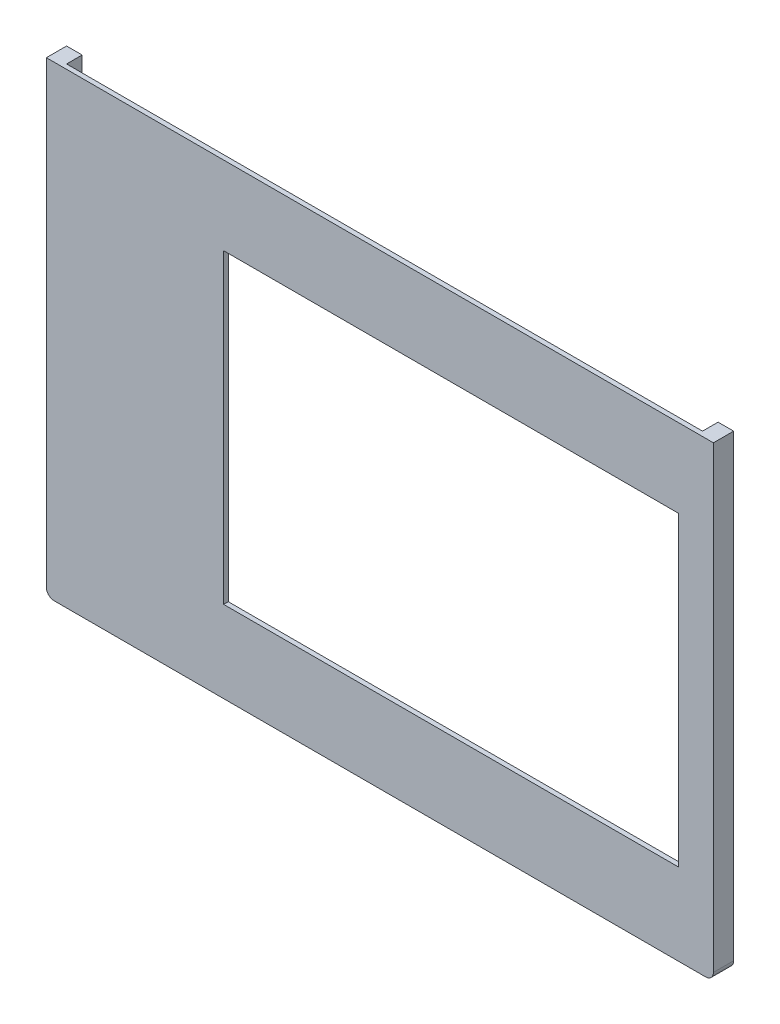
ISO-10303-21;
HEADER;
FILE_DESCRIPTION(('STEP AP214'),'2;1');
FILE_NAME('part.step','',(''),(''),'','','');
FILE_SCHEMA(('AUTOMOTIVE_DESIGN { 1 0 10303 214 1 1 1 1 }'));
ENDSEC;
DATA;
#1=APPLICATION_CONTEXT('core data for automotive mechanical design processes');
#2=APPLICATION_PROTOCOL_DEFINITION('international standard','automotive_design',2000,#1);
#3=PRODUCT_CONTEXT('',#1,'mechanical');
#4=PRODUCT('Part','Part','',(#3));
#5=PRODUCT_RELATED_PRODUCT_CATEGORY('part','',(#4));
#6=PRODUCT_DEFINITION_FORMATION('','',#4);
#7=PRODUCT_DEFINITION_CONTEXT('part definition',#1,'design');
#8=PRODUCT_DEFINITION('design','',#6,#7);
#9=PRODUCT_DEFINITION_SHAPE('','',#8);
#10=(LENGTH_UNIT() NAMED_UNIT(*) SI_UNIT(.MILLI.,.METRE.));
#11=(NAMED_UNIT(*) PLANE_ANGLE_UNIT() SI_UNIT($,.RADIAN.));
#12=(NAMED_UNIT(*) SI_UNIT($,.STERADIAN.) SOLID_ANGLE_UNIT());
#13=UNCERTAINTY_MEASURE_WITH_UNIT(LENGTH_MEASURE(1.E-05),#10,'distance_accuracy_value','');
#14=(GEOMETRIC_REPRESENTATION_CONTEXT(3) GLOBAL_UNCERTAINTY_ASSIGNED_CONTEXT((#13)) GLOBAL_UNIT_ASSIGNED_CONTEXT((#10,
#11,#12)) REPRESENTATION_CONTEXT('',''));
#15=CARTESIAN_POINT('',(0.,0.,0.));
#16=DIRECTION('',(0.,0.,1.));
#17=DIRECTION('',(1.,0.,0.));
#18=AXIS2_PLACEMENT_3D('',#15,#16,#17);
#19=CARTESIAN_POINT('',(0.,0.,0.));
#20=DIRECTION('',(0.,0.,1.));
#21=DIRECTION('',(1.,0.,0.));
#22=AXIS2_PLACEMENT_3D('',#19,#20,#21);
#23=PLANE('',#22);
#24=DIRECTION('',(0.,-1.,0.));
#25=VECTOR('',#24,1.);
#26=CARTESIAN_POINT('',(-20.1,19.9,0.));
#27=LINE('',#26,#25);
#28=CARTESIAN_POINT('',(-20.1,19.9,0.));
#29=VERTEX_POINT('',#28);
#30=CARTESIAN_POINT('',(-20.1,-19.5,0.));
#31=VERTEX_POINT('',#30);
#32=EDGE_CURVE('E218',#29,#31,#27,.T.);
#33=ORIENTED_EDGE('',*,*,#32,.T.);
#34=DIRECTION('',(1.,0.,0.));
#35=VECTOR('',#34,1.);
#36=CARTESIAN_POINT('',(-20.1,-19.5,0.));
#37=LINE('',#36,#35);
#38=CARTESIAN_POINT('',(38.4,-19.5,0.));
#39=VERTEX_POINT('',#38);
#40=EDGE_CURVE('E237',#31,#39,#37,.T.);
#41=ORIENTED_EDGE('',*,*,#40,.T.);
#42=DIRECTION('',(0.,1.,0.));
#43=VECTOR('',#42,1.);
#44=CARTESIAN_POINT('',(38.4,19.9,0.));
#45=LINE('',#44,#43);
#46=CARTESIAN_POINT('',(38.4,19.9,0.));
#47=VERTEX_POINT('',#46);
#48=EDGE_CURVE('E241',#39,#47,#45,.T.);
#49=ORIENTED_EDGE('',*,*,#48,.T.);
#50=DIRECTION('',(-1.,0.,0.));
#51=VECTOR('',#50,1.);
#52=CARTESIAN_POINT('',(-20.1,19.9,0.));
#53=LINE('',#52,#51);
#54=EDGE_CURVE('E223',#47,#29,#53,.T.);
#55=ORIENTED_EDGE('',*,*,#54,.T.);
#56=EDGE_LOOP('',(#33,#41,#49,#55));
#57=FACE_BOUND('',#56,.T.);
#58=DIRECTION('',(0.,1.,0.));
#59=VECTOR('',#58,1.);
#60=CARTESIAN_POINT('',(40.9,0.,0.));
#61=LINE('',#60,#59);
#62=CARTESIAN_POINT('',(40.9,-28.,0.));
#63=VERTEX_POINT('',#62);
#64=CARTESIAN_POINT('',(40.9,30.,0.));
#65=VERTEX_POINT('',#64);
#66=EDGE_CURVE('E203',#63,#65,#61,.T.);
#67=ORIENTED_EDGE('',*,*,#66,.F.);
#68=DIRECTION('',(-1.,0.,0.));
#69=VECTOR('',#68,1.);
#70=CARTESIAN_POINT('',(0.,-28.,0.));
#71=LINE('',#70,#69);
#72=CARTESIAN_POINT('',(-40.9,-28.,0.));
#73=VERTEX_POINT('',#72);
#74=EDGE_CURVE('E199',#63,#73,#71,.T.);
#75=ORIENTED_EDGE('',*,*,#74,.T.);
#76=DIRECTION('',(0.,1.,0.));
#77=VECTOR('',#76,1.);
#78=CARTESIAN_POINT('',(-40.9,0.,0.));
#79=LINE('',#78,#77);
#80=CARTESIAN_POINT('',(-40.9,30.,0.));
#81=VERTEX_POINT('',#80);
#82=EDGE_CURVE('E195',#73,#81,#79,.T.);
#83=ORIENTED_EDGE('',*,*,#82,.T.);
#84=DIRECTION('',(-1.,0.,0.));
#85=VECTOR('',#84,1.);
#86=CARTESIAN_POINT('',(-42.9,30.,0.));
#87=LINE('',#86,#85);
#88=EDGE_CURVE('E261',#65,#81,#87,.T.);
#89=ORIENTED_EDGE('',*,*,#88,.F.);
#90=EDGE_LOOP('',(#67,#75,#83,#89));
#91=FACE_BOUND('',#90,.T.);
#92=ADVANCED_FACE('F47',(#57,#91),#23,.F.);
#93=CARTESIAN_POINT('',(0.,0.,0.6));
#94=DIRECTION('',(0.,0.,1.));
#95=DIRECTION('',(1.,0.,0.));
#96=AXIS2_PLACEMENT_3D('',#93,#94,#95);
#97=PLANE('',#96);
#98=DIRECTION('',(0.,-1.,0.));
#99=VECTOR('',#98,1.);
#100=CARTESIAN_POINT('',(-42.9,30.,0.6));
#101=LINE('',#100,#99);
#102=CARTESIAN_POINT('',(-42.9,30.,0.6));
#103=VERTEX_POINT('',#102);
#104=CARTESIAN_POINT('',(-42.9,-29.,0.6));
#105=VERTEX_POINT('',#104);
#106=EDGE_CURVE('E165',#103,#105,#101,.T.);
#107=ORIENTED_EDGE('',*,*,#106,.T.);
#108=CARTESIAN_POINT('',(-41.9,-29.,0.6));
#109=DIRECTION('',(0.,0.,1.));
#110=DIRECTION('',(1.,0.,0.));
#111=AXIS2_PLACEMENT_3D('',#108,#109,#110);
#112=CIRCLE('',#111,1.);
#113=CARTESIAN_POINT('',(-41.9,-30.,0.6));
#114=VERTEX_POINT('',#113);
#115=EDGE_CURVE('E56',#105,#114,#112,.T.);
#116=ORIENTED_EDGE('',*,*,#115,.T.);
#117=DIRECTION('',(1.,0.,0.));
#118=VECTOR('',#117,1.);
#119=CARTESIAN_POINT('',(-42.9,-30.,0.6));
#120=LINE('',#119,#118);
#121=CARTESIAN_POINT('',(41.9,-30.,0.6));
#122=VERTEX_POINT('',#121);
#123=EDGE_CURVE('E170',#114,#122,#120,.T.);
#124=ORIENTED_EDGE('',*,*,#123,.T.);
#125=CARTESIAN_POINT('',(41.9,-29.,0.6));
#126=DIRECTION('',(0.,0.,1.));
#127=DIRECTION('',(1.,0.,0.));
#128=AXIS2_PLACEMENT_3D('',#125,#126,#127);
#129=CIRCLE('',#128,1.);
#130=CARTESIAN_POINT('',(42.9,-29.,0.6));
#131=VERTEX_POINT('',#130);
#132=EDGE_CURVE('E63',#122,#131,#129,.T.);
#133=ORIENTED_EDGE('',*,*,#132,.T.);
#134=DIRECTION('',(0.,1.,0.));
#135=VECTOR('',#134,1.);
#136=CARTESIAN_POINT('',(42.9,30.,0.6));
#137=LINE('',#136,#135);
#138=CARTESIAN_POINT('',(42.9,30.,0.6));
#139=VERTEX_POINT('',#138);
#140=EDGE_CURVE('E262',#131,#139,#137,.T.);
#141=ORIENTED_EDGE('',*,*,#140,.T.);
#142=DIRECTION('',(-1.,0.,0.));
#143=VECTOR('',#142,1.);
#144=CARTESIAN_POINT('',(-42.9,30.,0.6));
#145=LINE('',#144,#143);
#146=EDGE_CURVE('E265',#139,#103,#145,.T.);
#147=ORIENTED_EDGE('',*,*,#146,.T.);
#148=EDGE_LOOP('',(#107,#116,#124,#133,#141,#147));
#149=FACE_BOUND('',#148,.T.);
#150=DIRECTION('',(1.,0.,0.));
#151=VECTOR('',#150,1.);
#152=CARTESIAN_POINT('',(-20.1,-19.5,0.6));
#153=LINE('',#152,#151);
#154=CARTESIAN_POINT('',(-20.1,-19.5,0.6));
#155=VERTEX_POINT('',#154);
#156=CARTESIAN_POINT('',(38.4,-19.5,0.6));
#157=VERTEX_POINT('',#156);
#158=EDGE_CURVE('E222',#155,#157,#153,.T.);
#159=ORIENTED_EDGE('',*,*,#158,.F.);
#160=DIRECTION('',(0.,-1.,0.));
#161=VECTOR('',#160,1.);
#162=CARTESIAN_POINT('',(-20.1,19.9,0.6));
#163=LINE('',#162,#161);
#164=CARTESIAN_POINT('',(-20.1,19.9,0.6));
#165=VERTEX_POINT('',#164);
#166=EDGE_CURVE('E219',#165,#155,#163,.T.);
#167=ORIENTED_EDGE('',*,*,#166,.F.);
#168=DIRECTION('',(-1.,0.,0.));
#169=VECTOR('',#168,1.);
#170=CARTESIAN_POINT('',(-20.1,19.9,0.6));
#171=LINE('',#170,#169);
#172=CARTESIAN_POINT('',(38.4,19.9,0.6));
#173=VERTEX_POINT('',#172);
#174=EDGE_CURVE('E230',#173,#165,#171,.T.);
#175=ORIENTED_EDGE('',*,*,#174,.F.);
#176=DIRECTION('',(0.,1.,0.));
#177=VECTOR('',#176,1.);
#178=CARTESIAN_POINT('',(38.4,19.9,0.6));
#179=LINE('',#178,#177);
#180=EDGE_CURVE('E226',#157,#173,#179,.T.);
#181=ORIENTED_EDGE('',*,*,#180,.F.);
#182=EDGE_LOOP('',(#159,#167,#175,#181));
#183=FACE_BOUND('',#182,.T.);
#184=ADVANCED_FACE('F294',(#149,#183),#97,.T.);
#185=CARTESIAN_POINT('',(42.9,30.,0.6));
#186=DIRECTION('',(-1.,0.,0.));
#187=DIRECTION('',(0.,-1.,0.));
#188=AXIS2_PLACEMENT_3D('',#185,#186,#187);
#189=PLANE('',#188);
#190=ORIENTED_EDGE('',*,*,#140,.F.);
#191=DIRECTION('',(0.,0.,-1.));
#192=VECTOR('',#191,1.);
#193=CARTESIAN_POINT('',(42.9,-29.,0.6));
#194=LINE('',#193,#192);
#195=CARTESIAN_POINT('',(42.9,-29.,-2.));
#196=VERTEX_POINT('',#195);
#197=EDGE_CURVE('E11',#131,#196,#194,.T.);
#198=ORIENTED_EDGE('',*,*,#197,.T.);
#199=DIRECTION('',(0.,-1.,0.));
#200=VECTOR('',#199,1.);
#201=CARTESIAN_POINT('',(42.9,0.,-2.));
#202=LINE('',#201,#200);
#203=CARTESIAN_POINT('',(42.9,30.,-2.));
#204=VERTEX_POINT('',#203);
#205=EDGE_CURVE('E206',#204,#196,#202,.T.);
#206=ORIENTED_EDGE('',*,*,#205,.F.);
#207=DIRECTION('',(0.,0.,-1.));
#208=VECTOR('',#207,1.);
#209=CARTESIAN_POINT('',(42.9,30.,0.6));
#210=LINE('',#209,#208);
#211=EDGE_CURVE('E169',#139,#204,#210,.T.);
#212=ORIENTED_EDGE('',*,*,#211,.F.);
#213=EDGE_LOOP('',(#190,#198,#206,#212));
#214=FACE_BOUND('',#213,.T.);
#215=ADVANCED_FACE('F320',(#214),#189,.F.);
#216=CARTESIAN_POINT('',(-42.9,30.,0.6));
#217=DIRECTION('',(0.,-1.,0.));
#218=DIRECTION('',(0.,0.,-1.));
#219=AXIS2_PLACEMENT_3D('',#216,#217,#218);
#220=PLANE('',#219);
#221=ORIENTED_EDGE('',*,*,#211,.T.);
#222=DIRECTION('',(1.,0.,0.));
#223=VECTOR('',#222,1.);
#224=CARTESIAN_POINT('',(0.,30.,-2.));
#225=LINE('',#224,#223);
#226=CARTESIAN_POINT('',(40.9,30.,-2.));
#227=VERTEX_POINT('',#226);
#228=EDGE_CURVE('E190',#227,#204,#225,.T.);
#229=ORIENTED_EDGE('',*,*,#228,.F.);
#230=DIRECTION('',(0.,0.,1.));
#231=VECTOR('',#230,1.);
#232=CARTESIAN_POINT('',(40.9,30.,-2.));
#233=LINE('',#232,#231);
#234=EDGE_CURVE('E194',#227,#65,#233,.T.);
#235=ORIENTED_EDGE('',*,*,#234,.T.);
#236=ORIENTED_EDGE('',*,*,#88,.T.);
#237=DIRECTION('',(0.,0.,1.));
#238=VECTOR('',#237,1.);
#239=CARTESIAN_POINT('',(-40.9,30.,-2.));
#240=LINE('',#239,#238);
#241=CARTESIAN_POINT('',(-40.9,30.,-2.));
#242=VERTEX_POINT('',#241);
#243=EDGE_CURVE('E174',#242,#81,#240,.T.);
#244=ORIENTED_EDGE('',*,*,#243,.F.);
#245=DIRECTION('',(1.,0.,0.));
#246=VECTOR('',#245,1.);
#247=CARTESIAN_POINT('',(0.,30.,-2.));
#248=LINE('',#247,#246);
#249=CARTESIAN_POINT('',(-42.9,30.,-2.));
#250=VERTEX_POINT('',#249);
#251=EDGE_CURVE('E156',#250,#242,#248,.T.);
#252=ORIENTED_EDGE('',*,*,#251,.F.);
#253=DIRECTION('',(0.,0.,-1.));
#254=VECTOR('',#253,1.);
#255=CARTESIAN_POINT('',(-42.9,30.,0.6));
#256=LINE('',#255,#254);
#257=EDGE_CURVE('E163',#103,#250,#256,.T.);
#258=ORIENTED_EDGE('',*,*,#257,.F.);
#259=ORIENTED_EDGE('',*,*,#146,.F.);
#260=EDGE_LOOP('',(#221,#229,#235,#236,#244,#252,#258,#259));
#261=FACE_BOUND('',#260,.T.);
#262=ADVANCED_FACE('F172',(#261),#220,.F.);
#263=CARTESIAN_POINT('',(-42.9,30.,0.6));
#264=DIRECTION('',(1.,0.,0.));
#265=DIRECTION('',(0.,1.,0.));
#266=AXIS2_PLACEMENT_3D('',#263,#264,#265);
#267=PLANE('',#266);
#268=DIRECTION('',(0.,1.,0.));
#269=VECTOR('',#268,1.);
#270=CARTESIAN_POINT('',(-42.9,0.,-2.));
#271=LINE('',#270,#269);
#272=CARTESIAN_POINT('',(-42.9,-29.,-2.));
#273=VERTEX_POINT('',#272);
#274=EDGE_CURVE('E150',#273,#250,#271,.T.);
#275=ORIENTED_EDGE('',*,*,#274,.F.);
#276=DIRECTION('',(0.,0.,-1.));
#277=VECTOR('',#276,1.);
#278=CARTESIAN_POINT('',(-42.9,-29.,0.6));
#279=LINE('',#278,#277);
#280=EDGE_CURVE('E71',#273,#105,#279,.F.);
#281=ORIENTED_EDGE('',*,*,#280,.T.);
#282=ORIENTED_EDGE('',*,*,#106,.F.);
#283=ORIENTED_EDGE('',*,*,#257,.T.);
#284=EDGE_LOOP('',(#275,#281,#282,#283));
#285=FACE_BOUND('',#284,.T.);
#286=ADVANCED_FACE('F164',(#285),#267,.F.);
#287=CARTESIAN_POINT('',(-42.9,-30.,0.6));
#288=DIRECTION('',(0.,1.,0.));
#289=DIRECTION('',(0.,0.,1.));
#290=AXIS2_PLACEMENT_3D('',#287,#288,#289);
#291=PLANE('',#290);
#292=ORIENTED_EDGE('',*,*,#123,.F.);
#293=DIRECTION('',(0.,0.,-1.));
#294=VECTOR('',#293,1.);
#295=CARTESIAN_POINT('',(-41.9,-30.,0.6));
#296=LINE('',#295,#294);
#297=CARTESIAN_POINT('',(-41.9,-30.,-2.));
#298=VERTEX_POINT('',#297);
#299=EDGE_CURVE('E279',#114,#298,#296,.T.);
#300=ORIENTED_EDGE('',*,*,#299,.T.);
#301=DIRECTION('',(-1.,0.,0.));
#302=VECTOR('',#301,1.);
#303=CARTESIAN_POINT('',(0.,-30.,-2.));
#304=LINE('',#303,#302);
#305=CARTESIAN_POINT('',(41.9,-30.,-2.));
#306=VERTEX_POINT('',#305);
#307=EDGE_CURVE('E160',#306,#298,#304,.T.);
#308=ORIENTED_EDGE('',*,*,#307,.F.);
#309=DIRECTION('',(0.,0.,-1.));
#310=VECTOR('',#309,1.);
#311=CARTESIAN_POINT('',(41.9,-30.,0.6));
#312=LINE('',#311,#310);
#313=EDGE_CURVE('E276',#306,#122,#312,.F.);
#314=ORIENTED_EDGE('',*,*,#313,.T.);
#315=EDGE_LOOP('',(#292,#300,#308,#314));
#316=FACE_BOUND('',#315,.T.);
#317=ADVANCED_FACE('F299',(#316),#291,.F.);
#318=CARTESIAN_POINT('',(-20.1,19.9,0.6));
#319=DIRECTION('',(1.,0.,0.));
#320=DIRECTION('',(0.,1.,0.));
#321=AXIS2_PLACEMENT_3D('',#318,#319,#320);
#322=PLANE('',#321);
#323=ORIENTED_EDGE('',*,*,#32,.F.);
#324=DIRECTION('',(0.,0.,-1.));
#325=VECTOR('',#324,1.);
#326=CARTESIAN_POINT('',(-20.1,19.9,0.6));
#327=LINE('',#326,#325);
#328=EDGE_CURVE('E233',#165,#29,#327,.T.);
#329=ORIENTED_EDGE('',*,*,#328,.F.);
#330=ORIENTED_EDGE('',*,*,#166,.T.);
#331=DIRECTION('',(0.,0.,-1.));
#332=VECTOR('',#331,1.);
#333=CARTESIAN_POINT('',(-20.1,-19.5,0.6));
#334=LINE('',#333,#332);
#335=EDGE_CURVE('E257',#155,#31,#334,.T.);
#336=ORIENTED_EDGE('',*,*,#335,.T.);
#337=EDGE_LOOP('',(#323,#329,#330,#336));
#338=FACE_BOUND('',#337,.T.);
#339=ADVANCED_FACE('F327',(#338),#322,.T.);
#340=CARTESIAN_POINT('',(-20.1,-19.5,0.6));
#341=DIRECTION('',(0.,1.,0.));
#342=DIRECTION('',(0.,0.,1.));
#343=AXIS2_PLACEMENT_3D('',#340,#341,#342);
#344=PLANE('',#343);
#345=ORIENTED_EDGE('',*,*,#40,.F.);
#346=ORIENTED_EDGE('',*,*,#335,.F.);
#347=ORIENTED_EDGE('',*,*,#158,.T.);
#348=DIRECTION('',(0.,0.,-1.));
#349=VECTOR('',#348,1.);
#350=CARTESIAN_POINT('',(38.4,-19.5,0.6));
#351=LINE('',#350,#349);
#352=EDGE_CURVE('E254',#157,#39,#351,.T.);
#353=ORIENTED_EDGE('',*,*,#352,.T.);
#354=EDGE_LOOP('',(#345,#346,#347,#353));
#355=FACE_BOUND('',#354,.T.);
#356=ADVANCED_FACE('F369',(#355),#344,.T.);
#357=CARTESIAN_POINT('',(38.4,19.9,0.6));
#358=DIRECTION('',(-1.,0.,0.));
#359=DIRECTION('',(0.,-1.,0.));
#360=AXIS2_PLACEMENT_3D('',#357,#358,#359);
#361=PLANE('',#360);
#362=ORIENTED_EDGE('',*,*,#48,.F.);
#363=ORIENTED_EDGE('',*,*,#352,.F.);
#364=ORIENTED_EDGE('',*,*,#180,.T.);
#365=DIRECTION('',(0.,0.,-1.));
#366=VECTOR('',#365,1.);
#367=CARTESIAN_POINT('',(38.4,19.9,0.6));
#368=LINE('',#367,#366);
#369=EDGE_CURVE('E251',#173,#47,#368,.T.);
#370=ORIENTED_EDGE('',*,*,#369,.T.);
#371=EDGE_LOOP('',(#362,#363,#364,#370));
#372=FACE_BOUND('',#371,.T.);
#373=ADVANCED_FACE('F365',(#372),#361,.T.);
#374=CARTESIAN_POINT('',(-20.1,19.9,0.6));
#375=DIRECTION('',(0.,-1.,0.));
#376=DIRECTION('',(0.,0.,-1.));
#377=AXIS2_PLACEMENT_3D('',#374,#375,#376);
#378=PLANE('',#377);
#379=ORIENTED_EDGE('',*,*,#54,.F.);
#380=ORIENTED_EDGE('',*,*,#369,.F.);
#381=ORIENTED_EDGE('',*,*,#174,.T.);
#382=ORIENTED_EDGE('',*,*,#328,.T.);
#383=EDGE_LOOP('',(#379,#380,#381,#382));
#384=FACE_BOUND('',#383,.T.);
#385=ADVANCED_FACE('F363',(#384),#378,.T.);
#386=CARTESIAN_POINT('',(-40.9,0.,-2.));
#387=DIRECTION('',(1.,0.,0.));
#388=DIRECTION('',(0.,1.,0.));
#389=AXIS2_PLACEMENT_3D('',#386,#387,#388);
#390=PLANE('',#389);
#391=ORIENTED_EDGE('',*,*,#82,.F.);
#392=DIRECTION('',(0.,0.,1.));
#393=VECTOR('',#392,1.);
#394=CARTESIAN_POINT('',(-40.9,-28.,-2.));
#395=LINE('',#394,#393);
#396=CARTESIAN_POINT('',(-40.9,-28.,-2.));
#397=VERTEX_POINT('',#396);
#398=EDGE_CURVE('E213',#397,#73,#395,.T.);
#399=ORIENTED_EDGE('',*,*,#398,.F.);
#400=DIRECTION('',(0.,1.,0.));
#401=VECTOR('',#400,1.);
#402=CARTESIAN_POINT('',(-40.9,0.,-2.));
#403=LINE('',#402,#401);
#404=EDGE_CURVE('E177',#397,#242,#403,.T.);
#405=ORIENTED_EDGE('',*,*,#404,.T.);
#406=ORIENTED_EDGE('',*,*,#243,.T.);
#407=EDGE_LOOP('',(#391,#399,#405,#406));
#408=FACE_BOUND('',#407,.T.);
#409=ADVANCED_FACE('F351',(#408),#390,.T.);
#410=CARTESIAN_POINT('',(0.,-28.,-2.));
#411=DIRECTION('',(0.,1.,0.));
#412=DIRECTION('',(0.,0.,1.));
#413=AXIS2_PLACEMENT_3D('',#410,#411,#412);
#414=PLANE('',#413);
#415=ORIENTED_EDGE('',*,*,#74,.F.);
#416=DIRECTION('',(0.,0.,1.));
#417=VECTOR('',#416,1.);
#418=CARTESIAN_POINT('',(40.9,-28.,-2.));
#419=LINE('',#418,#417);
#420=CARTESIAN_POINT('',(40.9,-28.,-2.));
#421=VERTEX_POINT('',#420);
#422=EDGE_CURVE('E210',#421,#63,#419,.T.);
#423=ORIENTED_EDGE('',*,*,#422,.F.);
#424=DIRECTION('',(-1.,0.,0.));
#425=VECTOR('',#424,1.);
#426=CARTESIAN_POINT('',(0.,-28.,-2.));
#427=LINE('',#426,#425);
#428=EDGE_CURVE('E180',#421,#397,#427,.T.);
#429=ORIENTED_EDGE('',*,*,#428,.T.);
#430=ORIENTED_EDGE('',*,*,#398,.T.);
#431=EDGE_LOOP('',(#415,#423,#429,#430));
#432=FACE_BOUND('',#431,.T.);
#433=ADVANCED_FACE('F353',(#432),#414,.T.);
#434=CARTESIAN_POINT('',(40.9,0.,-2.));
#435=DIRECTION('',(1.,0.,0.));
#436=DIRECTION('',(0.,0.,-1.));
#437=AXIS2_PLACEMENT_3D('',#434,#435,#436);
#438=PLANE('',#437);
#439=ORIENTED_EDGE('',*,*,#66,.T.);
#440=ORIENTED_EDGE('',*,*,#234,.F.);
#441=DIRECTION('',(0.,1.,0.));
#442=VECTOR('',#441,1.);
#443=CARTESIAN_POINT('',(40.9,0.,-2.));
#444=LINE('',#443,#442);
#445=EDGE_CURVE('E187',#421,#227,#444,.T.);
#446=ORIENTED_EDGE('',*,*,#445,.F.);
#447=ORIENTED_EDGE('',*,*,#422,.T.);
#448=EDGE_LOOP('',(#439,#440,#446,#447));
#449=FACE_BOUND('',#448,.T.);
#450=ADVANCED_FACE('F309',(#449),#438,.F.);
#451=CARTESIAN_POINT('',(0.,0.,-2.));
#452=DIRECTION('',(0.,0.,-1.));
#453=DIRECTION('',(-1.,0.,0.));
#454=AXIS2_PLACEMENT_3D('',#451,#452,#453);
#455=PLANE('',#454);
#456=ORIENTED_EDGE('',*,*,#307,.T.);
#457=CARTESIAN_POINT('',(-41.9,-29.,-2.));
#458=DIRECTION('',(0.,0.,-1.));
#459=DIRECTION('',(-1.,0.,0.));
#460=AXIS2_PLACEMENT_3D('',#457,#458,#459);
#461=CIRCLE('',#460,1.);
#462=EDGE_CURVE('E158',#298,#273,#461,.T.);
#463=ORIENTED_EDGE('',*,*,#462,.T.);
#464=ORIENTED_EDGE('',*,*,#274,.T.);
#465=ORIENTED_EDGE('',*,*,#251,.T.);
#466=ORIENTED_EDGE('',*,*,#404,.F.);
#467=ORIENTED_EDGE('',*,*,#428,.F.);
#468=ORIENTED_EDGE('',*,*,#445,.T.);
#469=ORIENTED_EDGE('',*,*,#228,.T.);
#470=ORIENTED_EDGE('',*,*,#205,.T.);
#471=CARTESIAN_POINT('',(41.9,-29.,-2.));
#472=DIRECTION('',(0.,0.,-1.));
#473=DIRECTION('',(-1.,0.,0.));
#474=AXIS2_PLACEMENT_3D('',#471,#472,#473);
#475=CIRCLE('',#474,1.);
#476=EDGE_CURVE('E283',#196,#306,#475,.T.);
#477=ORIENTED_EDGE('',*,*,#476,.T.);
#478=EDGE_LOOP('',(#456,#463,#464,#465,#466,#467,#468,#469,#470,#477));
#479=FACE_BOUND('',#478,.T.);
#480=ADVANCED_FACE('F153',(#479),#455,.T.);
#481=CARTESIAN_POINT('',(-41.9,-29.,0.6));
#482=DIRECTION('',(0.,0.,-1.));
#483=DIRECTION('',(-1.,0.,0.));
#484=AXIS2_PLACEMENT_3D('',#481,#482,#483);
#485=CYLINDRICAL_SURFACE('',#484,1.);
#486=ORIENTED_EDGE('',*,*,#115,.F.);
#487=ORIENTED_EDGE('',*,*,#280,.F.);
#488=ORIENTED_EDGE('',*,*,#462,.F.);
#489=ORIENTED_EDGE('',*,*,#299,.F.);
#490=EDGE_LOOP('',(#486,#487,#488,#489));
#491=FACE_BOUND('',#490,.T.);
#492=ADVANCED_FACE('F302',(#491),#485,.T.);
#493=CARTESIAN_POINT('',(41.9,-29.,0.6));
#494=DIRECTION('',(0.,0.,-1.));
#495=DIRECTION('',(-1.,0.,0.));
#496=AXIS2_PLACEMENT_3D('',#493,#494,#495);
#497=CYLINDRICAL_SURFACE('',#496,1.);
#498=ORIENTED_EDGE('',*,*,#132,.F.);
#499=ORIENTED_EDGE('',*,*,#313,.F.);
#500=ORIENTED_EDGE('',*,*,#476,.F.);
#501=ORIENTED_EDGE('',*,*,#197,.F.);
#502=EDGE_LOOP('',(#498,#499,#500,#501));
#503=FACE_BOUND('',#502,.T.);
#504=ADVANCED_FACE('F49',(#503),#497,.T.);
#505=CLOSED_SHELL('',(#92,#184,#215,#262,#286,#317,#339,#356,#373,#385,#409,#433,#450,#480,#492,#504));
#506=MANIFOLD_SOLID_BREP('B2',#505);
#507=ADVANCED_BREP_SHAPE_REPRESENTATION('',(#18,#506),#14);
#508=SHAPE_DEFINITION_REPRESENTATION(#9,#507);
ENDSEC;
END-ISO-10303-21;
